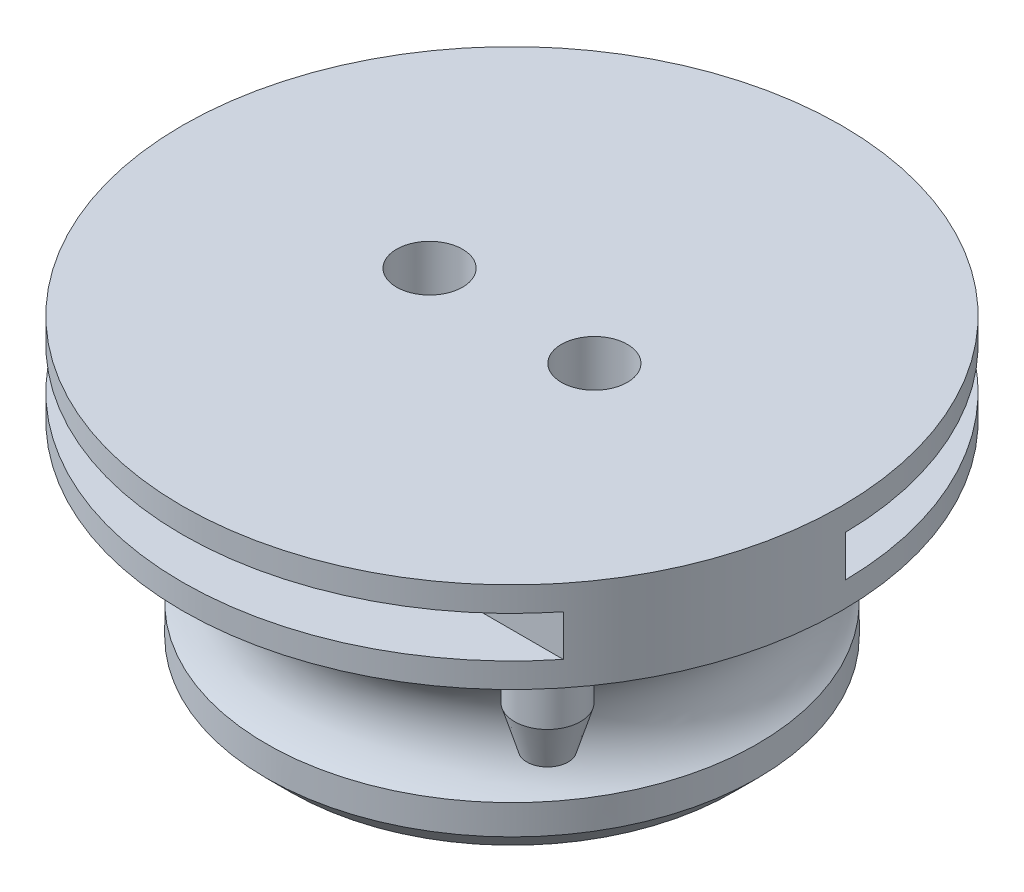
ISO-10303-21;
HEADER;
FILE_DESCRIPTION(('STEP AP214'),'2;1');
FILE_NAME('part.step','',(''),(''),'','','');
FILE_SCHEMA(('AUTOMOTIVE_DESIGN { 1 0 10303 214 1 1 1 1 }'));
ENDSEC;
DATA;
#1=APPLICATION_CONTEXT('core data for automotive mechanical design processes');
#2=APPLICATION_PROTOCOL_DEFINITION('international standard','automotive_design',2000,#1);
#3=PRODUCT_CONTEXT('',#1,'mechanical');
#4=PRODUCT('Part','Part','',(#3));
#5=PRODUCT_RELATED_PRODUCT_CATEGORY('part','',(#4));
#6=PRODUCT_DEFINITION_FORMATION('','',#4);
#7=PRODUCT_DEFINITION_CONTEXT('part definition',#1,'design');
#8=PRODUCT_DEFINITION('design','',#6,#7);
#9=PRODUCT_DEFINITION_SHAPE('','',#8);
#10=(LENGTH_UNIT() NAMED_UNIT(*) SI_UNIT(.MILLI.,.METRE.));
#11=(NAMED_UNIT(*) PLANE_ANGLE_UNIT() SI_UNIT($,.RADIAN.));
#12=(NAMED_UNIT(*) SI_UNIT($,.STERADIAN.) SOLID_ANGLE_UNIT());
#13=UNCERTAINTY_MEASURE_WITH_UNIT(LENGTH_MEASURE(1.E-05),#10,'distance_accuracy_value','');
#14=(GEOMETRIC_REPRESENTATION_CONTEXT(3) GLOBAL_UNCERTAINTY_ASSIGNED_CONTEXT((#13)) GLOBAL_UNIT_ASSIGNED_CONTEXT((#10,
#11,#12)) REPRESENTATION_CONTEXT('',''));
#15=CARTESIAN_POINT('',(0.,0.,0.));
#16=DIRECTION('',(0.,0.,1.));
#17=DIRECTION('',(1.,0.,0.));
#18=AXIS2_PLACEMENT_3D('',#15,#16,#17);
#19=CARTESIAN_POINT('',(0.,36.7,0.));
#20=DIRECTION('',(0.,-1.,0.));
#21=DIRECTION('',(0.,0.,-1.));
#22=AXIS2_PLACEMENT_3D('',#19,#20,#21);
#23=CYLINDRICAL_SURFACE('',#22,40.);
#24=CARTESIAN_POINT('',(0.,28.7,0.));
#25=DIRECTION('',(0.,1.,0.));
#26=DIRECTION('',(0.,0.,1.));
#27=AXIS2_PLACEMENT_3D('',#24,#25,#26);
#28=CIRCLE('',#27,40.);
#29=CARTESIAN_POINT('',(39.9971647780934,28.7,-0.476245434669288));
#30=VERTEX_POINT('',#29);
#31=CARTESIAN_POINT('',(-31.224989991992,28.7,-25.));
#32=VERTEX_POINT('',#31);
#33=EDGE_CURVE('E217',#30,#32,#28,.T.);
#34=ORIENTED_EDGE('',*,*,#33,.F.);
#35=DIRECTION('',(0.,1.,0.));
#36=VECTOR('',#35,1.);
#37=CARTESIAN_POINT('',(39.9971647780934,28.7,-0.476245434669288));
#38=LINE('',#37,#36);
#39=CARTESIAN_POINT('',(39.9971647780934,33.7,-0.476245434669288));
#40=VERTEX_POINT('',#39);
#41=EDGE_CURVE('E202',#30,#40,#38,.T.);
#42=ORIENTED_EDGE('',*,*,#41,.T.);
#43=CARTESIAN_POINT('',(0.,33.7,0.));
#44=DIRECTION('',(0.,1.,0.));
#45=DIRECTION('',(0.,0.,1.));
#46=AXIS2_PLACEMENT_3D('',#43,#44,#45);
#47=CIRCLE('',#46,40.);
#48=CARTESIAN_POINT('',(-31.224989991992,33.7,-25.));
#49=VERTEX_POINT('',#48);
#50=EDGE_CURVE('E234',#40,#49,#47,.T.);
#51=ORIENTED_EDGE('',*,*,#50,.T.);
#52=DIRECTION('',(0.,1.,0.));
#53=VECTOR('',#52,1.);
#54=CARTESIAN_POINT('',(-31.224989991992,28.7,-25.));
#55=LINE('',#54,#53);
#56=EDGE_CURVE('E233',#32,#49,#55,.T.);
#57=ORIENTED_EDGE('',*,*,#56,.F.);
#58=EDGE_LOOP('',(#34,#42,#51,#57));
#59=FACE_BOUND('',#58,.T.);
#60=CARTESIAN_POINT('',(0.,36.7,0.));
#61=DIRECTION('',(0.,1.,0.));
#62=DIRECTION('',(0.,0.,1.));
#63=AXIS2_PLACEMENT_3D('',#60,#61,#62);
#64=CIRCLE('',#63,40.);
#65=CARTESIAN_POINT('',(0.,36.7,40.));
#66=VERTEX_POINT('',#65);
#67=EDGE_CURVE('E411',#66,#66,#64,.T.);
#68=ORIENTED_EDGE('',*,*,#67,.F.);
#69=EDGE_LOOP('',(#68));
#70=FACE_BOUND('',#69,.T.);
#71=CARTESIAN_POINT('',(0.,25.7,0.));
#72=DIRECTION('',(0.,1.,0.));
#73=DIRECTION('',(0.,0.,1.));
#74=AXIS2_PLACEMENT_3D('',#71,#72,#73);
#75=CIRCLE('',#74,40.);
#76=CARTESIAN_POINT('',(0.,25.7,40.));
#77=VERTEX_POINT('',#76);
#78=EDGE_CURVE('E405',#77,#77,#75,.T.);
#79=ORIENTED_EDGE('',*,*,#78,.T.);
#80=EDGE_LOOP('',(#79));
#81=FACE_BOUND('',#80,.T.);
#82=CARTESIAN_POINT('',(0.,28.7,0.));
#83=DIRECTION('',(0.,1.,0.));
#84=DIRECTION('',(0.,0.,1.));
#85=AXIS2_PLACEMENT_3D('',#82,#83,#84);
#86=CIRCLE('',#85,40.);
#87=CARTESIAN_POINT('',(-39.9971647780934,28.7,0.476245434669288));
#88=VERTEX_POINT('',#87);
#89=CARTESIAN_POINT('',(31.224989991992,28.7,25.));
#90=VERTEX_POINT('',#89);
#91=EDGE_CURVE('E179',#88,#90,#86,.T.);
#92=ORIENTED_EDGE('',*,*,#91,.F.);
#93=DIRECTION('',(0.,1.,0.));
#94=VECTOR('',#93,1.);
#95=CARTESIAN_POINT('',(-39.9971647780934,28.7,0.476245434669288));
#96=LINE('',#95,#94);
#97=CARTESIAN_POINT('',(-39.9971647780934,33.7,0.476245434669288));
#98=VERTEX_POINT('',#97);
#99=EDGE_CURVE('E211',#88,#98,#96,.T.);
#100=ORIENTED_EDGE('',*,*,#99,.T.);
#101=CARTESIAN_POINT('',(0.,33.7,0.));
#102=DIRECTION('',(0.,1.,0.));
#103=DIRECTION('',(0.,0.,1.));
#104=AXIS2_PLACEMENT_3D('',#101,#102,#103);
#105=CIRCLE('',#104,40.);
#106=CARTESIAN_POINT('',(31.224989991992,33.7,25.));
#107=VERTEX_POINT('',#106);
#108=EDGE_CURVE('E185',#98,#107,#105,.T.);
#109=ORIENTED_EDGE('',*,*,#108,.T.);
#110=DIRECTION('',(0.,1.,0.));
#111=VECTOR('',#110,1.);
#112=CARTESIAN_POINT('',(31.224989991992,28.7,25.));
#113=LINE('',#112,#111);
#114=EDGE_CURVE('E207',#90,#107,#113,.T.);
#115=ORIENTED_EDGE('',*,*,#114,.F.);
#116=EDGE_LOOP('',(#92,#100,#109,#115));
#117=FACE_BOUND('',#116,.T.);
#118=ADVANCED_FACE('F89',(#59,#70,#81,#117),#23,.T.);
#119=CARTESIAN_POINT('',(0.,0.,0.));
#120=DIRECTION('',(0.,1.,0.));
#121=DIRECTION('',(0.,0.,1.));
#122=AXIS2_PLACEMENT_3D('',#119,#120,#121);
#123=PLANE('',#122);
#124=CARTESIAN_POINT('',(0.,0.,0.));
#125=DIRECTION('',(0.,1.,0.));
#126=DIRECTION('',(0.,0.,1.));
#127=AXIS2_PLACEMENT_3D('',#124,#125,#126);
#128=CIRCLE('',#127,20.2);
#129=CARTESIAN_POINT('',(0.,0.,-20.2));
#130=VERTEX_POINT('',#129);
#131=EDGE_CURVE('E426',#130,#130,#128,.T.);
#132=ORIENTED_EDGE('',*,*,#131,.T.);
#133=EDGE_LOOP('',(#132));
#134=FACE_BOUND('',#133,.T.);
#135=CARTESIAN_POINT('',(0.,0.,0.));
#136=DIRECTION('',(0.,1.,0.));
#137=DIRECTION('',(0.,0.,1.));
#138=AXIS2_PLACEMENT_3D('',#135,#136,#137);
#139=CIRCLE('',#138,26.8);
#140=CARTESIAN_POINT('',(0.,0.,26.8));
#141=VERTEX_POINT('',#140);
#142=EDGE_CURVE('E436',#141,#141,#139,.T.);
#143=ORIENTED_EDGE('',*,*,#142,.F.);
#144=EDGE_LOOP('',(#143));
#145=FACE_BOUND('',#144,.T.);
#146=ADVANCED_FACE('F459',(#134,#145),#123,.F.);
#147=CARTESIAN_POINT('',(0.,25.7,0.));
#148=DIRECTION('',(0.,-1.,0.));
#149=DIRECTION('',(0.,0.,-1.));
#150=AXIS2_PLACEMENT_3D('',#147,#148,#149);
#151=CYLINDRICAL_SURFACE('',#150,29.8);
#152=CARTESIAN_POINT('',(0.,25.7,0.));
#153=DIRECTION('',(0.,1.,0.));
#154=DIRECTION('',(0.,0.,1.));
#155=AXIS2_PLACEMENT_3D('',#152,#153,#154);
#156=CIRCLE('',#155,29.8);
#157=CARTESIAN_POINT('',(0.,25.7,-29.8));
#158=VERTEX_POINT('',#157);
#159=EDGE_CURVE('E422',#158,#158,#156,.T.);
#160=CARTESIAN_POINT('',(0.,18.7991802727908,0.));
#161=DIRECTION('',(0.,1.,0.));
#162=DIRECTION('',(0.,0.,1.));
#163=AXIS2_PLACEMENT_3D('',#160,#161,#162);
#164=CIRCLE('',#163,29.8);
#165=CARTESIAN_POINT('',(0.,18.7991802727908,-29.8));
#166=VERTEX_POINT('',#165);
#167=EDGE_CURVE('E430',#166,#166,#164,.T.);
#168=CARTESIAN_POINT('',(0.,25.7,-29.8));
#169=CARTESIAN_POINT('',(0.,25.6281164611749,-29.8));
#170=CARTESIAN_POINT('',(0.,25.5562329223498,-29.8));
#171=CARTESIAN_POINT('',(0.,25.4124658446996,-29.8));
#172=CARTESIAN_POINT('',(0.,25.3405823058745,-29.8));
#173=CARTESIAN_POINT('',(0.,25.1968152282243,-29.8));
#174=CARTESIAN_POINT('',(0.,25.1249316893992,-29.8));
#175=CARTESIAN_POINT('',(0.,24.981164611749,-29.8));
#176=CARTESIAN_POINT('',(0.,24.9092810729239,-29.8));
#177=CARTESIAN_POINT('',(0.,24.7655139952737,-29.8));
#178=CARTESIAN_POINT('',(0.,24.6936304564487,-29.8));
#179=CARTESIAN_POINT('',(0.,24.5498633787985,-29.8));
#180=CARTESIAN_POINT('',(0.,24.4779798399734,-29.8));
#181=CARTESIAN_POINT('',(0.,24.3342127623232,-29.8));
#182=CARTESIAN_POINT('',(0.,24.2623292234981,-29.8));
#183=CARTESIAN_POINT('',(0.,24.1185621458479,-29.8));
#184=CARTESIAN_POINT('',(0.,24.0466786070228,-29.8));
#185=CARTESIAN_POINT('',(0.,23.9029115293726,-29.8));
#186=CARTESIAN_POINT('',(0.,23.8310279905475,-29.8));
#187=CARTESIAN_POINT('',(0.,23.6872609128973,-29.8));
#188=CARTESIAN_POINT('',(0.,23.6153773740722,-29.8));
#189=CARTESIAN_POINT('',(0.,23.471610296422,-29.8));
#190=CARTESIAN_POINT('',(0.,23.3997267575969,-29.8));
#191=CARTESIAN_POINT('',(0.,23.2559596799467,-29.8));
#192=CARTESIAN_POINT('',(0.,23.1840761411216,-29.8));
#193=CARTESIAN_POINT('',(0.,23.0403090634714,-29.8));
#194=CARTESIAN_POINT('',(0.,22.9684255246463,-29.8));
#195=CARTESIAN_POINT('',(0.,22.8246584469961,-29.8));
#196=CARTESIAN_POINT('',(0.,22.7527749081711,-29.8));
#197=CARTESIAN_POINT('',(0.,22.6090078305209,-29.8));
#198=CARTESIAN_POINT('',(0.,22.5371242916958,-29.8));
#199=CARTESIAN_POINT('',(0.,22.3933572140456,-29.8));
#200=CARTESIAN_POINT('',(0.,22.3214736752205,-29.8));
#201=CARTESIAN_POINT('',(0.,22.1777065975703,-29.8));
#202=CARTESIAN_POINT('',(0.,22.1058230587452,-29.8));
#203=CARTESIAN_POINT('',(0.,21.962055981095,-29.8));
#204=CARTESIAN_POINT('',(0.,21.8901724422699,-29.8));
#205=CARTESIAN_POINT('',(0.,21.7464053646197,-29.8));
#206=CARTESIAN_POINT('',(0.,21.6745218257946,-29.8));
#207=CARTESIAN_POINT('',(0.,21.5307547481444,-29.8));
#208=CARTESIAN_POINT('',(0.,21.4588712093193,-29.8));
#209=CARTESIAN_POINT('',(0.,21.3151041316691,-29.8));
#210=CARTESIAN_POINT('',(0.,21.243220592844,-29.8));
#211=CARTESIAN_POINT('',(0.,21.0994535151938,-29.8));
#212=CARTESIAN_POINT('',(0.,21.0275699763687,-29.8));
#213=CARTESIAN_POINT('',(0.,20.8838028987185,-29.8));
#214=CARTESIAN_POINT('',(0.,20.8119193598935,-29.8));
#215=CARTESIAN_POINT('',(0.,20.6681522822433,-29.8));
#216=CARTESIAN_POINT('',(0.,20.5962687434182,-29.8));
#217=CARTESIAN_POINT('',(0.,20.452501665768,-29.8));
#218=CARTESIAN_POINT('',(0.,20.3806181269429,-29.8));
#219=CARTESIAN_POINT('',(0.,20.2368510492927,-29.8));
#220=CARTESIAN_POINT('',(0.,20.1649675104676,-29.8));
#221=CARTESIAN_POINT('',(0.,20.0212004328174,-29.8));
#222=CARTESIAN_POINT('',(0.,19.9493168939923,-29.8));
#223=CARTESIAN_POINT('',(0.,19.8055498163421,-29.8));
#224=CARTESIAN_POINT('',(0.,19.733666277517,-29.8));
#225=CARTESIAN_POINT('',(0.,19.5898991998668,-29.8));
#226=CARTESIAN_POINT('',(0.,19.5180156610417,-29.8));
#227=CARTESIAN_POINT('',(0.,19.3742485833915,-29.8));
#228=CARTESIAN_POINT('',(0.,19.3023650445664,-29.8));
#229=CARTESIAN_POINT('',(0.,19.1585979669162,-29.8));
#230=CARTESIAN_POINT('',(0.,19.0867144280911,-29.8));
#231=CARTESIAN_POINT('',(0.,18.9429473504409,-29.8));
#232=CARTESIAN_POINT('',(0.,18.8710638116159,-29.8));
#233=CARTESIAN_POINT('',(0.,18.7991802727908,-29.8));
#234=B_SPLINE_CURVE_WITH_KNOTS('',3,(#168,#169,#170,#171,#172,#173,#174,#175,#176,#177,#178,
#179,#180,#181,#182,#183,#184,#185,#186,#187,#188,#189,#190,#191,#192,#193,#194,#195,#196,#197,
#198,#199,#200,#201,#202,#203,#204,#205,#206,#207,#208,#209,#210,#211,#212,#213,#214,#215,#216,
#217,#218,#219,#220,#221,#222,#223,#224,#225,#226,#227,#228,#229,#230,#231,#232,#233),
.UNSPECIFIED.,.F.,.F.,(4,2,2,2,2,2,2,2,2,2,2,2,2,2,2,2,2,2,2,2,2,2,2,2,2,2,2,2,2,2,2,2,4),(0.,
0.215650616475292,0.431301232950581,0.64695184942587,0.862602465901158,1.07825308237645,
1.29390369885174,1.50955431532702,1.72520493180231,1.9408555482776,2.15650616475289,
2.37215678122818,2.58780739770347,2.80345801417876,3.01910863065405,3.23475924712933,
3.45040986360462,3.66606048007991,3.8817110965552,4.09736171303049,4.31301232950578,
4.52866294598107,4.74431356245636,4.95996417893164,5.17561479540693,5.39126541188222,
5.60691602835751,5.8225666448328,6.03821726130809,6.25386787778338,6.46951849425867,
6.68516911073395,6.90081972720924),.UNSPECIFIED.);
#235=EDGE_CURVE('BSEAM91',#158,#166,#234,.T.);
#236=ORIENTED_EDGE('',*,*,#159,.F.);
#237=ORIENTED_EDGE('',*,*,#167,.T.);
#238=ORIENTED_EDGE('',*,*,#235,.T.);
#239=ORIENTED_EDGE('',*,*,#235,.F.);
#240=EDGE_LOOP('',(#236,#238,#237,#239));
#241=FACE_BOUND('',#240,.T.);
#242=ADVANCED_FACE('F91',(#241),#151,.T.);
#243=CARTESIAN_POINT('',(0.,25.7,0.));
#244=DIRECTION('',(0.,-1.,0.));
#245=DIRECTION('',(0.,0.,-1.));
#246=AXIS2_PLACEMENT_3D('',#243,#244,#245);
#247=CYLINDRICAL_SURFACE('',#246,20.2);
#248=CARTESIAN_POINT('',(0.,25.7,0.));
#249=DIRECTION('',(0.,1.,0.));
#250=DIRECTION('',(0.,0.,1.));
#251=AXIS2_PLACEMENT_3D('',#248,#249,#250);
#252=CIRCLE('',#251,20.2);
#253=CARTESIAN_POINT('',(0.,25.7,-20.2));
#254=VERTEX_POINT('',#253);
#255=EDGE_CURVE('E431',#254,#254,#252,.T.);
#256=CARTESIAN_POINT('',(0.,25.7,-20.2));
#257=CARTESIAN_POINT('',(0.,25.4322916666667,-20.2));
#258=CARTESIAN_POINT('',(0.,25.1645833333333,-20.2));
#259=CARTESIAN_POINT('',(0.,24.6291666666667,-20.2));
#260=CARTESIAN_POINT('',(0.,24.3614583333333,-20.2));
#261=CARTESIAN_POINT('',(0.,23.8260416666667,-20.2));
#262=CARTESIAN_POINT('',(0.,23.5583333333333,-20.2));
#263=CARTESIAN_POINT('',(0.,23.0229166666667,-20.2));
#264=CARTESIAN_POINT('',(0.,22.7552083333333,-20.2));
#265=CARTESIAN_POINT('',(0.,22.2197916666667,-20.2));
#266=CARTESIAN_POINT('',(0.,21.9520833333333,-20.2));
#267=CARTESIAN_POINT('',(0.,21.4166666666667,-20.2));
#268=CARTESIAN_POINT('',(0.,21.1489583333333,-20.2));
#269=CARTESIAN_POINT('',(0.,20.6135416666667,-20.2));
#270=CARTESIAN_POINT('',(0.,20.3458333333333,-20.2));
#271=CARTESIAN_POINT('',(0.,19.8104166666667,-20.2));
#272=CARTESIAN_POINT('',(0.,19.5427083333333,-20.2));
#273=CARTESIAN_POINT('',(0.,19.0072916666667,-20.2));
#274=CARTESIAN_POINT('',(0.,18.7395833333333,-20.2));
#275=CARTESIAN_POINT('',(0.,18.2041666666667,-20.2));
#276=CARTESIAN_POINT('',(0.,17.9364583333333,-20.2));
#277=CARTESIAN_POINT('',(0.,17.4010416666667,-20.2));
#278=CARTESIAN_POINT('',(0.,17.1333333333333,-20.2));
#279=CARTESIAN_POINT('',(0.,16.5979166666667,-20.2));
#280=CARTESIAN_POINT('',(0.,16.3302083333333,-20.2));
#281=CARTESIAN_POINT('',(0.,15.7947916666667,-20.2));
#282=CARTESIAN_POINT('',(0.,15.5270833333333,-20.2));
#283=CARTESIAN_POINT('',(0.,14.9916666666667,-20.2));
#284=CARTESIAN_POINT('',(0.,14.7239583333333,-20.2));
#285=CARTESIAN_POINT('',(0.,14.1885416666667,-20.2));
#286=CARTESIAN_POINT('',(0.,13.9208333333333,-20.2));
#287=CARTESIAN_POINT('',(0.,13.3854166666667,-20.2));
#288=CARTESIAN_POINT('',(0.,13.1177083333333,-20.2));
#289=CARTESIAN_POINT('',(0.,12.5822916666667,-20.2));
#290=CARTESIAN_POINT('',(0.,12.3145833333333,-20.2));
#291=CARTESIAN_POINT('',(0.,11.7791666666667,-20.2));
#292=CARTESIAN_POINT('',(0.,11.5114583333333,-20.2));
#293=CARTESIAN_POINT('',(0.,10.9760416666667,-20.2));
#294=CARTESIAN_POINT('',(0.,10.7083333333333,-20.2));
#295=CARTESIAN_POINT('',(0.,10.1729166666667,-20.2));
#296=CARTESIAN_POINT('',(0.,9.90520833333333,-20.2));
#297=CARTESIAN_POINT('',(0.,9.36979166666666,-20.2));
#298=CARTESIAN_POINT('',(0.,9.10208333333333,-20.2));
#299=CARTESIAN_POINT('',(0.,8.56666666666666,-20.2));
#300=CARTESIAN_POINT('',(0.,8.29895833333333,-20.2));
#301=CARTESIAN_POINT('',(0.,7.76354166666666,-20.2));
#302=CARTESIAN_POINT('',(0.,7.49583333333333,-20.2));
#303=CARTESIAN_POINT('',(0.,6.96041666666666,-20.2));
#304=CARTESIAN_POINT('',(0.,6.69270833333333,-20.2));
#305=CARTESIAN_POINT('',(0.,6.15729166666666,-20.2));
#306=CARTESIAN_POINT('',(0.,5.88958333333333,-20.2));
#307=CARTESIAN_POINT('',(0.,5.35416666666666,-20.2));
#308=CARTESIAN_POINT('',(0.,5.08645833333333,-20.2));
#309=CARTESIAN_POINT('',(0.,4.55104166666666,-20.2));
#310=CARTESIAN_POINT('',(0.,4.28333333333333,-20.2));
#311=CARTESIAN_POINT('',(0.,3.74791666666666,-20.2));
#312=CARTESIAN_POINT('',(0.,3.48020833333333,-20.2));
#313=CARTESIAN_POINT('',(0.,2.94479166666666,-20.2));
#314=CARTESIAN_POINT('',(0.,2.67708333333333,-20.2));
#315=CARTESIAN_POINT('',(0.,2.14166666666666,-20.2));
#316=CARTESIAN_POINT('',(0.,1.87395833333333,-20.2));
#317=CARTESIAN_POINT('',(0.,1.33854166666666,-20.2));
#318=CARTESIAN_POINT('',(0.,1.07083333333333,-20.2));
#319=CARTESIAN_POINT('',(0.,0.535416666666664,-20.2));
#320=CARTESIAN_POINT('',(0.,0.26770833333333,-20.2));
#321=CARTESIAN_POINT('',(0.,0.,-20.2));
#322=B_SPLINE_CURVE_WITH_KNOTS('',3,(#256,#257,#258,#259,#260,#261,#262,#263,#264,#265,#266,
#267,#268,#269,#270,#271,#272,#273,#274,#275,#276,#277,#278,#279,#280,#281,#282,#283,#284,#285,
#286,#287,#288,#289,#290,#291,#292,#293,#294,#295,#296,#297,#298,#299,#300,#301,#302,#303,#304,
#305,#306,#307,#308,#309,#310,#311,#312,#313,#314,#315,#316,#317,#318,#319,#320,#321),
.UNSPECIFIED.,.F.,.F.,(4,2,2,2,2,2,2,2,2,2,2,2,2,2,2,2,2,2,2,2,2,2,2,2,2,2,2,2,2,2,2,2,4),(0.,
0.803124999999998,1.60625,2.409375,3.2125,4.015625,4.81875,5.621875,6.425,7.228125,8.03125,
8.834375,9.6375,10.440625,11.24375,12.046875,12.85,13.653125,14.45625,15.259375,16.0625,
16.865625,17.66875,18.471875,19.275,20.078125,20.88125,21.684375,22.4875,23.290625,24.09375,
24.896875,25.7),.UNSPECIFIED.);
#323=EDGE_CURVE('BSEAM730',#254,#130,#322,.T.);
#324=ORIENTED_EDGE('',*,*,#255,.T.);
#325=ORIENTED_EDGE('',*,*,#131,.F.);
#326=ORIENTED_EDGE('',*,*,#323,.T.);
#327=ORIENTED_EDGE('',*,*,#323,.F.);
#328=EDGE_LOOP('',(#324,#326,#325,#327));
#329=FACE_BOUND('',#328,.T.);
#330=ADVANCED_FACE('F730',(#329),#247,.F.);
#331=CARTESIAN_POINT('',(0.,3.00000000000001,0.));
#332=DIRECTION('',(0.,1.,0.));
#333=DIRECTION('',(0.,0.,1.));
#334=AXIS2_PLACEMENT_3D('',#331,#332,#333);
#335=CONICAL_SURFACE('',#334,29.8,0.785398163397445);
#336=ORIENTED_EDGE('',*,*,#142,.T.);
#337=EDGE_LOOP('',(#336));
#338=FACE_BOUND('',#337,.T.);
#339=CARTESIAN_POINT('',(0.,3.00000000000001,0.));
#340=DIRECTION('',(0.,1.,0.));
#341=DIRECTION('',(0.,0.,1.));
#342=AXIS2_PLACEMENT_3D('',#339,#340,#341);
#343=CIRCLE('',#342,29.8);
#344=CARTESIAN_POINT('',(0.,3.00000000000001,-29.8));
#345=VERTEX_POINT('',#344);
#346=EDGE_CURVE('E435',#345,#345,#343,.T.);
#347=ORIENTED_EDGE('',*,*,#346,.F.);
#348=EDGE_LOOP('',(#347));
#349=FACE_BOUND('',#348,.T.);
#350=ADVANCED_FACE('F720',(#338,#349),#335,.T.);
#351=CARTESIAN_POINT('',(0.,12.7,0.));
#352=DIRECTION('',(0.,1.,0.));
#353=DIRECTION('',(0.,0.,1.));
#354=AXIS2_PLACEMENT_3D('',#351,#352,#353);
#355=TOROIDAL_SURFACE('',#354,34.5,7.7);
#356=CARTESIAN_POINT('',(0.,6.60081972720924,0.));
#357=DIRECTION('',(0.,1.,0.));
#358=DIRECTION('',(0.,0.,1.));
#359=AXIS2_PLACEMENT_3D('',#356,#357,#358);
#360=CIRCLE('',#359,29.8);
#361=CARTESIAN_POINT('',(0.,6.60081972720924,-29.8));
#362=VERTEX_POINT('',#361);
#363=EDGE_CURVE('E440',#362,#362,#360,.T.);
#364=ORIENTED_EDGE('',*,*,#363,.T.);
#365=EDGE_LOOP('',(#364));
#366=FACE_BOUND('',#365,.T.);
#367=ORIENTED_EDGE('',*,*,#167,.F.);
#368=EDGE_LOOP('',(#367));
#369=FACE_BOUND('',#368,.T.);
#370=ADVANCED_FACE('F716',(#366,#369),#355,.F.);
#371=CARTESIAN_POINT('',(0.,3.00000000000001,-29.8));
#372=CARTESIAN_POINT('',(0.,3.03750853882511,-29.8));
#373=CARTESIAN_POINT('',(0.,3.07501707765021,-29.8));
#374=CARTESIAN_POINT('',(0.,3.1500341553004,-29.8));
#375=CARTESIAN_POINT('',(0.,3.18754269412549,-29.8));
#376=CARTESIAN_POINT('',(0.,3.26255977177569,-29.8));
#377=CARTESIAN_POINT('',(0.,3.30006831060078,-29.8));
#378=CARTESIAN_POINT('',(0.,3.37508538825097,-29.8));
#379=CARTESIAN_POINT('',(0.,3.41259392707607,-29.8));
#380=CARTESIAN_POINT('',(0.,3.48761100472626,-29.8));
#381=CARTESIAN_POINT('',(0.,3.52511954355136,-29.8));
#382=CARTESIAN_POINT('',(0.,3.60013662120155,-29.8));
#383=CARTESIAN_POINT('',(0.,3.63764516002665,-29.8));
#384=CARTESIAN_POINT('',(0.,3.71266223767684,-29.8));
#385=CARTESIAN_POINT('',(0.,3.75017077650193,-29.8));
#386=CARTESIAN_POINT('',(0.,3.82518785415213,-29.8));
#387=CARTESIAN_POINT('',(0.,3.86269639297722,-29.8));
#388=CARTESIAN_POINT('',(0.,3.93771347062742,-29.8));
#389=CARTESIAN_POINT('',(0.,3.97522200945251,-29.8));
#390=CARTESIAN_POINT('',(0.,4.0502390871027,-29.8));
#391=CARTESIAN_POINT('',(0.,4.0877476259278,-29.8));
#392=CARTESIAN_POINT('',(0.,4.16276470357799,-29.8));
#393=CARTESIAN_POINT('',(0.,4.20027324240309,-29.8));
#394=CARTESIAN_POINT('',(0.,4.27529032005328,-29.8));
#395=CARTESIAN_POINT('',(0.,4.31279885887838,-29.8));
#396=CARTESIAN_POINT('',(0.,4.38781593652857,-29.8));
#397=CARTESIAN_POINT('',(0.,4.42532447535367,-29.8));
#398=CARTESIAN_POINT('',(0.,4.50034155300386,-29.8));
#399=CARTESIAN_POINT('',(0.,4.53785009182895,-29.8));
#400=CARTESIAN_POINT('',(0.,4.61286716947915,-29.8));
#401=CARTESIAN_POINT('',(0.,4.65037570830424,-29.8));
#402=CARTESIAN_POINT('',(0.,4.72539278595443,-29.8));
#403=CARTESIAN_POINT('',(0.,4.76290132477953,-29.8));
#404=CARTESIAN_POINT('',(0.,4.83791840242972,-29.8));
#405=CARTESIAN_POINT('',(0.,4.87542694125482,-29.8));
#406=CARTESIAN_POINT('',(0.,4.95044401890501,-29.8));
#407=CARTESIAN_POINT('',(0.,4.98795255773011,-29.8));
#408=CARTESIAN_POINT('',(0.,5.0629696353803,-29.8));
#409=CARTESIAN_POINT('',(0.,5.1004781742054,-29.8));
#410=CARTESIAN_POINT('',(0.,5.17549525185559,-29.8));
#411=CARTESIAN_POINT('',(0.,5.21300379068068,-29.8));
#412=CARTESIAN_POINT('',(0.,5.28802086833088,-29.8));
#413=CARTESIAN_POINT('',(0.,5.32552940715597,-29.8));
#414=CARTESIAN_POINT('',(0.,5.40054648480617,-29.8));
#415=CARTESIAN_POINT('',(0.,5.43805502363126,-29.8));
#416=CARTESIAN_POINT('',(0.,5.51307210128145,-29.8));
#417=CARTESIAN_POINT('',(0.,5.55058064010655,-29.8));
#418=CARTESIAN_POINT('',(0.,5.62559771775674,-29.8));
#419=CARTESIAN_POINT('',(0.,5.66310625658184,-29.8));
#420=CARTESIAN_POINT('',(0.,5.73812333423203,-29.8));
#421=CARTESIAN_POINT('',(0.,5.77563187305713,-29.8));
#422=CARTESIAN_POINT('',(0.,5.85064895070732,-29.8));
#423=CARTESIAN_POINT('',(0.,5.88815748953242,-29.8));
#424=CARTESIAN_POINT('',(0.,5.96317456718261,-29.8));
#425=CARTESIAN_POINT('',(0.,6.0006831060077,-29.8));
#426=CARTESIAN_POINT('',(0.,6.0757001836579,-29.8));
#427=CARTESIAN_POINT('',(0.,6.11320872248299,-29.8));
#428=CARTESIAN_POINT('',(0.,6.18822580013318,-29.8));
#429=CARTESIAN_POINT('',(0.,6.22573433895828,-29.8));
#430=CARTESIAN_POINT('',(0.,6.30075141660847,-29.8));
#431=CARTESIAN_POINT('',(0.,6.33825995543357,-29.8));
#432=CARTESIAN_POINT('',(0.,6.41327703308376,-29.8));
#433=CARTESIAN_POINT('',(0.,6.45078557190886,-29.8));
#434=CARTESIAN_POINT('',(0.,6.52580264955905,-29.8));
#435=CARTESIAN_POINT('',(0.,6.56331118838414,-29.8));
#436=CARTESIAN_POINT('',(0.,6.60081972720924,-29.8));
#437=B_SPLINE_CURVE_WITH_KNOTS('',3,(#371,#372,#373,#374,#375,#376,#377,#378,#379,#380,#381,
#382,#383,#384,#385,#386,#387,#388,#389,#390,#391,#392,#393,#394,#395,#396,#397,#398,#399,#400,
#401,#402,#403,#404,#405,#406,#407,#408,#409,#410,#411,#412,#413,#414,#415,#416,#417,#418,#419,
#420,#421,#422,#423,#424,#425,#426,#427,#428,#429,#430,#431,#432,#433,#434,#435,#436),
.UNSPECIFIED.,.F.,.F.,(4,2,2,2,2,2,2,2,2,2,2,2,2,2,2,2,2,2,2,2,2,2,2,2,2,2,2,2,2,2,2,2,4),(0.,
0.11252561647529,0.225051232950576,0.337576849425866,0.450102465901152,0.562628082376442,
0.675153698851731,0.787679315327017,0.900204931802307,1.0127305482776,1.12525616475288,
1.23778178122817,1.35030739770346,1.46283301417875,1.57535863065404,1.68788424712932,
1.80040986360461,1.9129354800799,2.02546109655519,2.13798671303048,2.25051232950577,
2.36303794598106,2.47556356245635,2.58808917893163,2.70061479540692,2.81314041188221,
2.9256660283575,3.03819164483279,3.15071726130808,3.26324287778336,3.37576849425865,
3.48829411073394,3.60081972720923),.UNSPECIFIED.);
#438=EDGE_CURVE('BSEAM561',#345,#362,#437,.T.);
#439=ORIENTED_EDGE('',*,*,#346,.T.);
#440=ORIENTED_EDGE('',*,*,#363,.F.);
#441=ORIENTED_EDGE('',*,*,#438,.T.);
#442=ORIENTED_EDGE('',*,*,#438,.F.);
#443=EDGE_LOOP('',(#439,#441,#440,#442));
#444=FACE_BOUND('',#443,.T.);
#445=ADVANCED_FACE('F561',(#444),#151,.T.);
#446=CARTESIAN_POINT('',(0.,25.7,0.));
#447=DIRECTION('',(0.,1.,0.));
#448=DIRECTION('',(0.,0.,1.));
#449=AXIS2_PLACEMENT_3D('',#446,#447,#448);
#450=PLANE('',#449);
#451=CARTESIAN_POINT('',(10.,25.7,0.));
#452=DIRECTION('',(0.,-1.,0.));
#453=DIRECTION('',(0.,0.,-1.));
#454=AXIS2_PLACEMENT_3D('',#451,#452,#453);
#455=CIRCLE('',#454,4.);
#456=CARTESIAN_POINT('',(10.,25.7,-4.));
#457=VERTEX_POINT('',#456);
#458=EDGE_CURVE('E238',#457,#457,#455,.T.);
#459=ORIENTED_EDGE('',*,*,#458,.F.);
#460=EDGE_LOOP('',(#459));
#461=FACE_BOUND('',#460,.T.);
#462=CARTESIAN_POINT('',(-10.,25.7,0.));
#463=DIRECTION('',(0.,-1.,0.));
#464=DIRECTION('',(0.,0.,-1.));
#465=AXIS2_PLACEMENT_3D('',#462,#463,#464);
#466=CIRCLE('',#465,4.);
#467=CARTESIAN_POINT('',(-10.,25.7,-4.));
#468=VERTEX_POINT('',#467);
#469=EDGE_CURVE('E192',#468,#468,#466,.T.);
#470=ORIENTED_EDGE('',*,*,#469,.F.);
#471=EDGE_LOOP('',(#470));
#472=FACE_BOUND('',#471,.T.);
#473=ORIENTED_EDGE('',*,*,#255,.F.);
#474=EDGE_LOOP('',(#473));
#475=FACE_BOUND('',#474,.T.);
#476=ADVANCED_FACE('F556',(#461,#472,#475),#450,.F.);
#477=CARTESIAN_POINT('',(0.,36.7,0.));
#478=DIRECTION('',(0.,1.,0.));
#479=DIRECTION('',(0.,0.,1.));
#480=AXIS2_PLACEMENT_3D('',#477,#478,#479);
#481=PLANE('',#480);
#482=CARTESIAN_POINT('',(10.,36.7,0.));
#483=DIRECTION('',(0.,1.,0.));
#484=DIRECTION('',(0.,0.,1.));
#485=AXIS2_PLACEMENT_3D('',#482,#483,#484);
#486=CIRCLE('',#485,4.);
#487=CARTESIAN_POINT('',(10.,36.7,4.));
#488=VERTEX_POINT('',#487);
#489=EDGE_CURVE('E844',#488,#488,#486,.F.);
#490=ORIENTED_EDGE('',*,*,#489,.T.);
#491=EDGE_LOOP('',(#490));
#492=FACE_BOUND('',#491,.T.);
#493=CARTESIAN_POINT('',(-10.,36.7,0.));
#494=DIRECTION('',(0.,1.,0.));
#495=DIRECTION('',(0.,0.,1.));
#496=AXIS2_PLACEMENT_3D('',#493,#494,#495);
#497=CIRCLE('',#496,4.);
#498=CARTESIAN_POINT('',(-10.,36.7,4.));
#499=VERTEX_POINT('',#498);
#500=EDGE_CURVE('E850',#499,#499,#497,.F.);
#501=ORIENTED_EDGE('',*,*,#500,.T.);
#502=EDGE_LOOP('',(#501));
#503=FACE_BOUND('',#502,.T.);
#504=ORIENTED_EDGE('',*,*,#67,.T.);
#505=EDGE_LOOP('',(#504));
#506=FACE_BOUND('',#505,.T.);
#507=ADVANCED_FACE('F455',(#492,#503,#506),#481,.T.);
#508=CARTESIAN_POINT('',(6.07768621834294,25.7,-34.4682713554272));
#509=DIRECTION('',(0.,1.,0.));
#510=DIRECTION('',(0.,0.,1.));
#511=AXIS2_PLACEMENT_3D('',#508,#509,#510);
#512=CIRCLE('',#511,3.99999999999999);
#513=CARTESIAN_POINT('',(6.07768621834294,25.7,-30.4682713554272));
#514=VERTEX_POINT('',#513);
#515=EDGE_CURVE('E12',#514,#514,#512,.F.);
#516=ORIENTED_EDGE('',*,*,#515,.F.);
#517=EDGE_LOOP('',(#516));
#518=FACE_BOUND('',#517,.T.);
#519=CARTESIAN_POINT('',(26.811555509164,25.7,22.4975663390291));
#520=DIRECTION('',(0.,1.,0.));
#521=DIRECTION('',(0.,0.,1.));
#522=AXIS2_PLACEMENT_3D('',#519,#520,#521);
#523=CIRCLE('',#522,3.99999999999999);
#524=CARTESIAN_POINT('',(26.811555509164,25.7,26.4975663390291));
#525=VERTEX_POINT('',#524);
#526=EDGE_CURVE('E101',#525,#525,#523,.F.);
#527=ORIENTED_EDGE('',*,*,#526,.F.);
#528=EDGE_LOOP('',(#527));
#529=FACE_BOUND('',#528,.T.);
#530=CARTESIAN_POINT('',(-32.8892417275069,25.7,11.9707050163982));
#531=DIRECTION('',(0.,1.,0.));
#532=DIRECTION('',(0.,0.,1.));
#533=AXIS2_PLACEMENT_3D('',#530,#531,#532);
#534=CIRCLE('',#533,4.);
#535=CARTESIAN_POINT('',(-32.8892417275069,25.7,15.9707050163982));
#536=VERTEX_POINT('',#535);
#537=EDGE_CURVE('E418',#536,#536,#534,.F.);
#538=ORIENTED_EDGE('',*,*,#537,.F.);
#539=EDGE_LOOP('',(#538));
#540=FACE_BOUND('',#539,.T.);
#541=ORIENTED_EDGE('',*,*,#159,.T.);
#542=EDGE_LOOP('',(#541));
#543=FACE_BOUND('',#542,.T.);
#544=ORIENTED_EDGE('',*,*,#78,.F.);
#545=EDGE_LOOP('',(#544));
#546=FACE_BOUND('',#545,.T.);
#547=ADVANCED_FACE('F564',(#518,#529,#540,#543,#546),#450,.F.);
#548=CARTESIAN_POINT('',(-32.8892417275069,20.7,11.9707050163982));
#549=DIRECTION('',(0.,1.,0.));
#550=DIRECTION('',(0.,0.,1.));
#551=AXIS2_PLACEMENT_3D('',#548,#549,#550);
#552=CYLINDRICAL_SURFACE('',#551,4.);
#553=CARTESIAN_POINT('',(-32.8892417275069,20.7,11.9707050163982));
#554=DIRECTION('',(0.,1.,0.));
#555=DIRECTION('',(0.,0.,1.));
#556=AXIS2_PLACEMENT_3D('',#553,#554,#555);
#557=CIRCLE('',#556,4.);
#558=CARTESIAN_POINT('',(-32.8892417275069,20.7,15.9707050163982));
#559=VERTEX_POINT('',#558);
#560=EDGE_CURVE('E402',#559,#559,#557,.F.);
#561=ORIENTED_EDGE('',*,*,#560,.F.);
#562=EDGE_LOOP('',(#561));
#563=FACE_BOUND('',#562,.T.);
#564=ORIENTED_EDGE('',*,*,#537,.T.);
#565=EDGE_LOOP('',(#564));
#566=FACE_BOUND('',#565,.T.);
#567=ADVANCED_FACE('F385',(#563,#566),#552,.T.);
#568=CARTESIAN_POINT('',(26.811555509164,20.7,22.4975663390291));
#569=DIRECTION('',(0.,1.,0.));
#570=DIRECTION('',(0.,0.,1.));
#571=AXIS2_PLACEMENT_3D('',#568,#569,#570);
#572=CYLINDRICAL_SURFACE('',#571,3.99999999999999);
#573=CARTESIAN_POINT('',(26.811555509164,20.7,22.4975663390291));
#574=DIRECTION('',(0.,-1.,0.));
#575=DIRECTION('',(0.444872770790535,0.,0.895593779460952));
#576=AXIS2_PLACEMENT_3D('',#573,#574,#575);
#577=CIRCLE('',#576,3.99999999999999);
#578=CARTESIAN_POINT('',(28.5910465923262,20.7,26.0799414568729));
#579=VERTEX_POINT('',#578);
#580=EDGE_CURVE('E313',#579,#579,#577,.T.);
#581=ORIENTED_EDGE('',*,*,#580,.F.);
#582=EDGE_LOOP('',(#581));
#583=FACE_BOUND('',#582,.T.);
#584=ORIENTED_EDGE('',*,*,#526,.T.);
#585=EDGE_LOOP('',(#584));
#586=FACE_BOUND('',#585,.T.);
#587=ADVANCED_FACE('F380',(#583,#586),#572,.T.);
#588=CARTESIAN_POINT('',(6.07768621834294,20.7,-34.4682713554272));
#589=DIRECTION('',(0.,1.,0.));
#590=DIRECTION('',(0.,0.,1.));
#591=AXIS2_PLACEMENT_3D('',#588,#589,#590);
#592=CYLINDRICAL_SURFACE('',#591,3.99999999999999);
#593=CARTESIAN_POINT('',(9.92274277805961,20.7,-33.3657560255656));
#594=CARTESIAN_POINT('',(9.77842385886114,20.7,-32.8624392988722));
#595=CARTESIAN_POINT('',(9.28977565144664,20.7,-31.9131559766337));
#596=CARTESIAN_POINT('',(8.06747882510487,20.7,-30.8786077206912));
#597=CARTESIAN_POINT('',(6.54237405059633,20.6999999999999,-30.3903848743829));
#598=CARTESIAN_POINT('',(4.94641337355436,20.7,-30.5229748243665));
#599=CARTESIAN_POINT('',(3.52274631687992,20.7,-31.2562126757547));
#600=CARTESIAN_POINT('',(2.48800272529876,20.7,-32.4784609405589));
#601=CARTESIAN_POINT('',(1.9998203520143,20.6999999999999,-34.0036035943985));
#602=CARTESIAN_POINT('',(2.13238257146794,20.7000000000001,-35.5995311130102));
#603=CARTESIAN_POINT('',(2.86565092307496,20.6999999999999,-37.0232146843214));
#604=CARTESIAN_POINT('',(4.08783717913791,20.7000000000001,-38.0579334382041));
#605=CARTESIAN_POINT('',(5.61303375546752,20.6999999999999,-38.5461552368652));
#606=CARTESIAN_POINT('',(7.2089311065233,20.7000000000001,-38.413575902648));
#607=CARTESIAN_POINT('',(8.63265749261439,20.7,-37.6803134973326));
#608=CARTESIAN_POINT('',(9.66732267582051,20.7,-36.458112990236));
#609=CARTESIAN_POINT('',(10.1556891666374,20.7,-34.9330563367945));
#610=CARTESIAN_POINT('',(10.0670616972581,20.7,-33.8690727522591));
#611=CARTESIAN_POINT('',(9.92274277805961,20.7,-33.3657560255656));
#612=B_SPLINE_CURVE_WITH_KNOTS('',3,(#593,#594,#595,#596,#597,#598,#599,#600,#601,#602,#603,
#604,#605,#606,#607,#608,#609,#610,#611),.UNSPECIFIED.,.T.,.F.,(4,1,1,1,1,1,1,1,1,1,1,1,1,1,1,1,
4),(0.,0.0625,0.125,0.1875,0.25,0.3125,0.375,0.4375,0.5,0.5625,0.625,0.6875,0.75,0.8125,0.875,
0.9375,1.),.UNSPECIFIED.);
#613=CARTESIAN_POINT('',(9.92274277805961,20.7,-33.3657560255656));
#614=VERTEX_POINT('',#613);
#615=EDGE_CURVE('E262',#614,#614,#612,.T.);
#616=ORIENTED_EDGE('',*,*,#615,.F.);
#617=EDGE_LOOP('',(#616));
#618=FACE_BOUND('',#617,.T.);
#619=ORIENTED_EDGE('',*,*,#515,.T.);
#620=EDGE_LOOP('',(#619));
#621=FACE_BOUND('',#620,.T.);
#622=ADVANCED_FACE('F376',(#618,#621),#592,.T.);
#623=CARTESIAN_POINT('',(-32.8892417275069,15.7,11.9707050163982));
#624=DIRECTION('',(0.,-1.,0.));
#625=DIRECTION('',(0.,0.,-1.));
#626=AXIS2_PLACEMENT_3D('',#623,#624,#625);
#627=PLANE('',#626);
#628=CARTESIAN_POINT('',(-32.8892417275069,15.7,11.9707050163982));
#629=DIRECTION('',(0.,-1.,0.));
#630=DIRECTION('',(0.,0.,-1.));
#631=AXIS2_PLACEMENT_3D('',#628,#629,#630);
#632=CIRCLE('',#631,2.5);
#633=CARTESIAN_POINT('',(-32.8892417275069,15.7,9.4707050163982));
#634=VERTEX_POINT('',#633);
#635=EDGE_CURVE('E347',#634,#634,#632,.T.);
#636=ORIENTED_EDGE('',*,*,#635,.T.);
#637=EDGE_LOOP('',(#636));
#638=FACE_BOUND('',#637,.T.);
#639=ADVANCED_FACE('F368',(#638),#627,.T.);
#640=CARTESIAN_POINT('',(-32.8892417275069,15.7,11.9707050163982));
#641=DIRECTION('',(0.,1.,0.));
#642=DIRECTION('',(0.,0.,1.));
#643=AXIS2_PLACEMENT_3D('',#640,#641,#642);
#644=CONICAL_SURFACE('',#643,2.5,0.291456794477866);
#645=ORIENTED_EDGE('',*,*,#560,.T.);
#646=EDGE_LOOP('',(#645));
#647=FACE_BOUND('',#646,.T.);
#648=ORIENTED_EDGE('',*,*,#635,.F.);
#649=EDGE_LOOP('',(#648));
#650=FACE_BOUND('',#649,.T.);
#651=ADVANCED_FACE('F329',(#647,#650),#644,.T.);
#652=CARTESIAN_POINT('',(26.811555509164,15.7,22.4975663390291));
#653=DIRECTION('',(0.,1.,0.));
#654=DIRECTION('',(0.,0.,1.));
#655=AXIS2_PLACEMENT_3D('',#652,#653,#654);
#656=CONICAL_SURFACE('',#655,2.5,0.291456794477866);
#657=ORIENTED_EDGE('',*,*,#580,.T.);
#658=EDGE_LOOP('',(#657));
#659=FACE_BOUND('',#658,.T.);
#660=CARTESIAN_POINT('',(26.811555509164,15.7,22.4975663390291));
#661=DIRECTION('',(0.,-1.,0.));
#662=DIRECTION('',(0.,0.,-1.));
#663=AXIS2_PLACEMENT_3D('',#660,#661,#662);
#664=CIRCLE('',#663,2.5);
#665=CARTESIAN_POINT('',(26.811555509164,15.7,19.9975663390291));
#666=VERTEX_POINT('',#665);
#667=EDGE_CURVE('E306',#666,#666,#664,.T.);
#668=ORIENTED_EDGE('',*,*,#667,.F.);
#669=EDGE_LOOP('',(#668));
#670=FACE_BOUND('',#669,.T.);
#671=ADVANCED_FACE('F320',(#659,#670),#656,.T.);
#672=CARTESIAN_POINT('',(26.811555509164,15.7,22.4975663390291));
#673=DIRECTION('',(0.,-1.,0.));
#674=DIRECTION('',(0.,0.,-1.));
#675=AXIS2_PLACEMENT_3D('',#672,#673,#674);
#676=PLANE('',#675);
#677=ORIENTED_EDGE('',*,*,#667,.T.);
#678=EDGE_LOOP('',(#677));
#679=FACE_BOUND('',#678,.T.);
#680=ADVANCED_FACE('F282',(#679),#676,.T.);
#681=CARTESIAN_POINT('',(9.92274277805961,20.7,-33.3657560255656));
#682=CARTESIAN_POINT('',(8.3134388370188,15.7,-33.3496068712837));
#683=CARTESIAN_POINT('',(9.77842385886114,20.7,-32.8624392988722));
#684=CARTESIAN_POINT('',(8.1670059984681,15.7,-33.0569475378639));
#685=CARTESIAN_POINT('',(9.28977565144664,20.7,-31.9131559766337));
#686=CARTESIAN_POINT('',(7.75786880844799,15.7,-32.5298056169366));
#687=CARTESIAN_POINT('',(8.06747882510487,20.7,-30.8786077206912));
#688=CARTESIAN_POINT('',(6.88811309006884,15.7,-32.0345065129057));
#689=CARTESIAN_POINT('',(6.54237405059633,20.6999999999999,-30.3903848743829));
#690=CARTESIAN_POINT('',(5.89513790244253,15.7,-31.9096028192392));
#691=CARTESIAN_POINT('',(4.94641337355436,20.7,-30.5229748243665));
#692=CARTESIAN_POINT('',(4.92984946776882,15.7,-32.1742340814621));
#693=CARTESIAN_POINT('',(3.52274631687992,20.7,-31.2562126757547));
#694=CARTESIAN_POINT('',(4.13934895097468,15.7,-32.7881122925071));
#695=CARTESIAN_POINT('',(2.48800272529876,20.7,-32.4784609405589));
#696=CARTESIAN_POINT('',(3.64393579852019,15.7,-33.6577485262203));
#697=CARTESIAN_POINT('',(1.9998203520143,20.6999999999999,-34.0036035943985));
#698=CARTESIAN_POINT('',(3.51900528718902,15.7,-34.6508287679121));
#699=CARTESIAN_POINT('',(2.13238257146794,20.7000000000001,-35.5995311130102));
#700=CARTESIAN_POINT('',(3.78365855238356,15.7,-35.6160939070435));
#701=CARTESIAN_POINT('',(2.86565092307496,20.6999999999999,-37.0232146843214));
#702=CARTESIAN_POINT('',(4.39752464211803,15.7,-36.4066295251371));
#703=CARTESIAN_POINT('',(4.08783717913791,20.7000000000001,-38.0579334382041));
#704=CARTESIAN_POINT('',(5.26722667980561,15.7,-36.9020428523116));
#705=CARTESIAN_POINT('',(5.61303375546752,20.6999999999999,-38.5461552368652));
#706=CARTESIAN_POINT('',(6.26025415130623,15.7,-37.0269340507888));
#707=CARTESIAN_POINT('',(7.2089311065233,20.7000000000001,-38.413575902648));
#708=CARTESIAN_POINT('',(7.22550794664661,15.7,-36.7623161458233));
#709=CARTESIAN_POINT('',(8.63265749261439,20.7,-37.6803134973326));
#710=CARTESIAN_POINT('',(8.01603992173317,15.7,-36.1484182199216));
#711=CARTESIAN_POINT('',(9.66732267582051,20.7,-36.458112990236));
#712=CARTESIAN_POINT('',(8.51141172707929,15.7,-35.2788163395182));
#713=CARTESIAN_POINT('',(10.1556891666374,20.7,-34.9330563367945));
#714=CARTESIAN_POINT('',(8.63646583975224,15.7,-34.2857616174557));
#715=CARTESIAN_POINT('',(10.0670616972581,20.7,-33.8690727522591));
#716=CARTESIAN_POINT('',(8.45987167556951,15.7,-33.6422662047036));
#717=CARTESIAN_POINT('',(9.92274277805961,20.7,-33.3657560255656));
#718=CARTESIAN_POINT('',(8.3134388370188,15.7,-33.3496068712837));
#719=B_SPLINE_SURFACE_WITH_KNOTS('',3,1,((#681,#682),(#683,#684),(#685,#686),(#687,#688),(#689,
#690),(#691,#692),(#693,#694),(#695,#696),(#697,#698),(#699,#700),(#701,#702),(#703,#704),(#705,
#706),(#707,#708),(#709,#710),(#711,#712),(#713,#714),(#715,#716),(#717,#718)),.UNSPECIFIED.,
.T.,.F.,.F.,(4,1,1,1,1,1,1,1,1,1,1,1,1,1,1,1,4),(2,2),(0.,0.0625,0.125,0.1875,0.25,0.3125,0.375,
0.4375,0.5,0.5625,0.625,0.6875,0.75,0.8125,0.875,0.9375,1.),(0.,1.),.UNSPECIFIED.);
#720=CARTESIAN_POINT('',(6.07768621834294,15.7,-34.4682713554272));
#721=DIRECTION('',(0.,-1.,0.));
#722=DIRECTION('',(0.,0.,-1.));
#723=AXIS2_PLACEMENT_3D('',#720,#721,#722);
#724=CIRCLE('',#723,2.5);
#725=CARTESIAN_POINT('',(6.07768621834294,15.7,-36.9682713554272));
#726=VERTEX_POINT('',#725);
#727=EDGE_CURVE('E210',#726,#726,#724,.T.);
#728=ORIENTED_EDGE('',*,*,#615,.T.);
#729=EDGE_LOOP('',(#728));
#730=FACE_BOUND('',#729,.T.);
#731=ORIENTED_EDGE('',*,*,#727,.F.);
#732=EDGE_LOOP('',(#731));
#733=FACE_BOUND('',#732,.T.);
#734=ADVANCED_FACE('F269',(#730,#733),#719,.T.);
#735=CARTESIAN_POINT('',(6.07768621834294,15.7,-34.4682713554272));
#736=DIRECTION('',(0.,-1.,0.));
#737=DIRECTION('',(0.,0.,-1.));
#738=AXIS2_PLACEMENT_3D('',#735,#736,#737);
#739=PLANE('',#738);
#740=ORIENTED_EDGE('',*,*,#727,.T.);
#741=EDGE_LOOP('',(#740));
#742=FACE_BOUND('',#741,.T.);
#743=ADVANCED_FACE('F281',(#742),#739,.T.);
#744=CARTESIAN_POINT('',(0.,28.7,0.));
#745=DIRECTION('',(0.0119061358667322,0.,0.999929119452335));
#746=DIRECTION('',(0.999929119452335,0.,-0.0119061358667322));
#747=AXIS2_PLACEMENT_3D('',#744,#745,#746);
#748=PLANE('',#747);
#749=DIRECTION('',(0.999929119452336,0.,-0.0119061358667322));
#750=VECTOR('',#749,1.);
#751=CARTESIAN_POINT('',(0.,33.7,0.));
#752=LINE('',#751,#750);
#753=CARTESIAN_POINT('',(24.9982279863084,33.7,-0.297653396668305));
#754=VERTEX_POINT('',#753);
#755=EDGE_CURVE('E222',#754,#40,#752,.T.);
#756=ORIENTED_EDGE('',*,*,#755,.T.);
#757=ORIENTED_EDGE('',*,*,#41,.F.);
#758=DIRECTION('',(0.999929119452336,0.,-0.0119061358667322));
#759=VECTOR('',#758,1.);
#760=CARTESIAN_POINT('',(0.,28.7,0.));
#761=LINE('',#760,#759);
#762=CARTESIAN_POINT('',(24.9982279863084,28.7,-0.297653396668305));
#763=VERTEX_POINT('',#762);
#764=EDGE_CURVE('E229',#763,#30,#761,.T.);
#765=ORIENTED_EDGE('',*,*,#764,.F.);
#766=DIRECTION('',(0.,1.,0.));
#767=VECTOR('',#766,1.);
#768=CARTESIAN_POINT('',(24.9982279863084,28.7,-0.297653396668305));
#769=LINE('',#768,#767);
#770=EDGE_CURVE('E250',#763,#754,#769,.T.);
#771=ORIENTED_EDGE('',*,*,#770,.T.);
#772=EDGE_LOOP('',(#756,#757,#765,#771));
#773=FACE_BOUND('',#772,.T.);
#774=ADVANCED_FACE('F486',(#773),#748,.F.);
#775=CARTESIAN_POINT('',(0.,28.7,0.));
#776=DIRECTION('',(0.,1.,0.));
#777=DIRECTION('',(0.,0.,1.));
#778=AXIS2_PLACEMENT_3D('',#775,#776,#777);
#779=CYLINDRICAL_SURFACE('',#778,25.);
#780=CARTESIAN_POINT('',(0.,33.7,0.));
#781=DIRECTION('',(0.,1.,0.));
#782=DIRECTION('',(0.,0.,1.));
#783=AXIS2_PLACEMENT_3D('',#780,#781,#782);
#784=CIRCLE('',#783,25.);
#785=CARTESIAN_POINT('',(0.,33.7,-25.));
#786=VERTEX_POINT('',#785);
#787=EDGE_CURVE('E241',#754,#786,#784,.T.);
#788=ORIENTED_EDGE('',*,*,#787,.F.);
#789=ORIENTED_EDGE('',*,*,#770,.F.);
#790=CARTESIAN_POINT('',(0.,28.7,0.));
#791=DIRECTION('',(0.,1.,0.));
#792=DIRECTION('',(0.,0.,1.));
#793=AXIS2_PLACEMENT_3D('',#790,#791,#792);
#794=CIRCLE('',#793,25.);
#795=CARTESIAN_POINT('',(0.,28.7,-25.));
#796=VERTEX_POINT('',#795);
#797=EDGE_CURVE('E226',#763,#796,#794,.T.);
#798=ORIENTED_EDGE('',*,*,#797,.T.);
#799=DIRECTION('',(0.,1.,0.));
#800=VECTOR('',#799,1.);
#801=CARTESIAN_POINT('',(0.,28.7,-25.));
#802=LINE('',#801,#800);
#803=EDGE_CURVE('E253',#796,#786,#802,.T.);
#804=ORIENTED_EDGE('',*,*,#803,.T.);
#805=EDGE_LOOP('',(#788,#789,#798,#804));
#806=FACE_BOUND('',#805,.T.);
#807=ADVANCED_FACE('F488',(#806),#779,.T.);
#808=CARTESIAN_POINT('',(0.,28.7,-25.));
#809=DIRECTION('',(0.,0.,1.));
#810=DIRECTION('',(1.,0.,0.));
#811=AXIS2_PLACEMENT_3D('',#808,#809,#810);
#812=PLANE('',#811);
#813=DIRECTION('',(1.,0.,0.));
#814=VECTOR('',#813,1.);
#815=CARTESIAN_POINT('',(0.,33.7,-25.));
#816=LINE('',#815,#814);
#817=EDGE_CURVE('E117',#49,#786,#816,.T.);
#818=ORIENTED_EDGE('',*,*,#817,.T.);
#819=ORIENTED_EDGE('',*,*,#803,.F.);
#820=DIRECTION('',(1.,0.,0.));
#821=VECTOR('',#820,1.);
#822=CARTESIAN_POINT('',(0.,28.7,-25.));
#823=LINE('',#822,#821);
#824=EDGE_CURVE('E221',#32,#796,#823,.T.);
#825=ORIENTED_EDGE('',*,*,#824,.F.);
#826=ORIENTED_EDGE('',*,*,#56,.T.);
#827=EDGE_LOOP('',(#818,#819,#825,#826));
#828=FACE_BOUND('',#827,.T.);
#829=ADVANCED_FACE('F283',(#828),#812,.F.);
#830=CARTESIAN_POINT('',(0.,28.7,0.));
#831=DIRECTION('',(0.,1.,0.));
#832=DIRECTION('',(0.,0.,1.));
#833=AXIS2_PLACEMENT_3D('',#830,#831,#832);
#834=PLANE('',#833);
#835=ORIENTED_EDGE('',*,*,#33,.T.);
#836=ORIENTED_EDGE('',*,*,#824,.T.);
#837=ORIENTED_EDGE('',*,*,#797,.F.);
#838=ORIENTED_EDGE('',*,*,#764,.T.);
#839=EDGE_LOOP('',(#835,#836,#837,#838));
#840=FACE_BOUND('',#839,.T.);
#841=ADVANCED_FACE('F480',(#840),#834,.T.);
#842=CARTESIAN_POINT('',(0.,33.7,0.));
#843=DIRECTION('',(0.,1.,0.));
#844=DIRECTION('',(0.,0.,1.));
#845=AXIS2_PLACEMENT_3D('',#842,#843,#844);
#846=PLANE('',#845);
#847=ORIENTED_EDGE('',*,*,#50,.F.);
#848=ORIENTED_EDGE('',*,*,#755,.F.);
#849=ORIENTED_EDGE('',*,*,#787,.T.);
#850=ORIENTED_EDGE('',*,*,#817,.F.);
#851=EDGE_LOOP('',(#847,#848,#849,#850));
#852=FACE_BOUND('',#851,.T.);
#853=ADVANCED_FACE('F475',(#852),#846,.F.);
#854=CARTESIAN_POINT('',(0.,28.7,25.));
#855=DIRECTION('',(0.,0.,1.));
#856=DIRECTION('',(1.,0.,0.));
#857=AXIS2_PLACEMENT_3D('',#854,#855,#856);
#858=PLANE('',#857);
#859=DIRECTION('',(1.,0.,0.));
#860=VECTOR('',#859,1.);
#861=CARTESIAN_POINT('',(0.,33.7,25.));
#862=LINE('',#861,#860);
#863=CARTESIAN_POINT('',(0.,33.7,25.));
#864=VERTEX_POINT('',#863);
#865=EDGE_CURVE('E109',#864,#107,#862,.T.);
#866=ORIENTED_EDGE('',*,*,#865,.F.);
#867=DIRECTION('',(0.,1.,0.));
#868=VECTOR('',#867,1.);
#869=CARTESIAN_POINT('',(0.,28.7,25.));
#870=LINE('',#869,#868);
#871=CARTESIAN_POINT('',(0.,28.7,25.));
#872=VERTEX_POINT('',#871);
#873=EDGE_CURVE('E165',#872,#864,#870,.T.);
#874=ORIENTED_EDGE('',*,*,#873,.F.);
#875=DIRECTION('',(1.,0.,0.));
#876=VECTOR('',#875,1.);
#877=CARTESIAN_POINT('',(0.,28.7,25.));
#878=LINE('',#877,#876);
#879=EDGE_CURVE('E173',#872,#90,#878,.T.);
#880=ORIENTED_EDGE('',*,*,#879,.T.);
#881=ORIENTED_EDGE('',*,*,#114,.T.);
#882=EDGE_LOOP('',(#866,#874,#880,#881));
#883=FACE_BOUND('',#882,.T.);
#884=ADVANCED_FACE('F176',(#883),#858,.T.);
#885=CARTESIAN_POINT('',(0.,28.7,0.));
#886=DIRECTION('',(-0.0119061358667322,0.,-0.999929119452335));
#887=DIRECTION('',(-0.999929119452335,0.,0.0119061358667322));
#888=AXIS2_PLACEMENT_3D('',#885,#886,#887);
#889=PLANE('',#888);
#890=DIRECTION('',(-0.999929119452336,0.,0.0119061358667322));
#891=VECTOR('',#890,1.);
#892=CARTESIAN_POINT('',(0.,33.7,0.));
#893=LINE('',#892,#891);
#894=CARTESIAN_POINT('',(-24.9982279863084,33.7,0.297653396668305));
#895=VERTEX_POINT('',#894);
#896=EDGE_CURVE('E189',#895,#98,#893,.T.);
#897=ORIENTED_EDGE('',*,*,#896,.T.);
#898=ORIENTED_EDGE('',*,*,#99,.F.);
#899=DIRECTION('',(-0.999929119452336,0.,0.0119061358667322));
#900=VECTOR('',#899,1.);
#901=CARTESIAN_POINT('',(0.,28.7,0.));
#902=LINE('',#901,#900);
#903=CARTESIAN_POINT('',(-24.9982279863084,28.7,0.297653396668305));
#904=VERTEX_POINT('',#903);
#905=EDGE_CURVE('E172',#904,#88,#902,.T.);
#906=ORIENTED_EDGE('',*,*,#905,.F.);
#907=DIRECTION('',(0.,1.,0.));
#908=VECTOR('',#907,1.);
#909=CARTESIAN_POINT('',(-24.9982279863084,28.7,0.297653396668305));
#910=LINE('',#909,#908);
#911=EDGE_CURVE('E166',#904,#895,#910,.T.);
#912=ORIENTED_EDGE('',*,*,#911,.T.);
#913=EDGE_LOOP('',(#897,#898,#906,#912));
#914=FACE_BOUND('',#913,.T.);
#915=ADVANCED_FACE('F467',(#914),#889,.F.);
#916=CARTESIAN_POINT('',(0.,28.7,0.));
#917=DIRECTION('',(0.,1.,0.));
#918=DIRECTION('',(0.,0.,1.));
#919=AXIS2_PLACEMENT_3D('',#916,#917,#918);
#920=CYLINDRICAL_SURFACE('',#919,25.);
#921=CARTESIAN_POINT('',(0.,33.7,0.));
#922=DIRECTION('',(0.,1.,0.));
#923=DIRECTION('',(0.,0.,1.));
#924=AXIS2_PLACEMENT_3D('',#921,#922,#923);
#925=CIRCLE('',#924,25.);
#926=EDGE_CURVE('E201',#895,#864,#925,.T.);
#927=ORIENTED_EDGE('',*,*,#926,.F.);
#928=ORIENTED_EDGE('',*,*,#911,.F.);
#929=CARTESIAN_POINT('',(0.,28.7,0.));
#930=DIRECTION('',(0.,1.,0.));
#931=DIRECTION('',(0.,0.,1.));
#932=AXIS2_PLACEMENT_3D('',#929,#930,#931);
#933=CIRCLE('',#932,25.);
#934=EDGE_CURVE('E161',#904,#872,#933,.T.);
#935=ORIENTED_EDGE('',*,*,#934,.T.);
#936=ORIENTED_EDGE('',*,*,#873,.T.);
#937=EDGE_LOOP('',(#927,#928,#935,#936));
#938=FACE_BOUND('',#937,.T.);
#939=ADVANCED_FACE('F164',(#938),#920,.T.);
#940=CARTESIAN_POINT('',(0.,28.7,0.));
#941=DIRECTION('',(0.,1.,0.));
#942=DIRECTION('',(0.,0.,1.));
#943=AXIS2_PLACEMENT_3D('',#940,#941,#942);
#944=PLANE('',#943);
#945=ORIENTED_EDGE('',*,*,#879,.F.);
#946=ORIENTED_EDGE('',*,*,#934,.F.);
#947=ORIENTED_EDGE('',*,*,#905,.T.);
#948=ORIENTED_EDGE('',*,*,#91,.T.);
#949=EDGE_LOOP('',(#945,#946,#947,#948));
#950=FACE_BOUND('',#949,.T.);
#951=ADVANCED_FACE('F181',(#950),#944,.T.);
#952=CARTESIAN_POINT('',(0.,33.7,0.));
#953=DIRECTION('',(0.,1.,0.));
#954=DIRECTION('',(0.,0.,1.));
#955=AXIS2_PLACEMENT_3D('',#952,#953,#954);
#956=PLANE('',#955);
#957=ORIENTED_EDGE('',*,*,#865,.T.);
#958=ORIENTED_EDGE('',*,*,#108,.F.);
#959=ORIENTED_EDGE('',*,*,#896,.F.);
#960=ORIENTED_EDGE('',*,*,#926,.T.);
#961=EDGE_LOOP('',(#957,#958,#959,#960));
#962=FACE_BOUND('',#961,.T.);
#963=ADVANCED_FACE('F465',(#962),#956,.F.);
#964=CARTESIAN_POINT('',(-10.,36.701,0.));
#965=DIRECTION('',(0.,-1.,0.));
#966=DIRECTION('',(0.,0.,-1.));
#967=AXIS2_PLACEMENT_3D('',#964,#965,#966);
#968=CYLINDRICAL_SURFACE('',#967,4.);
#969=ORIENTED_EDGE('',*,*,#500,.F.);
#970=EDGE_LOOP('',(#969));
#971=FACE_BOUND('',#970,.T.);
#972=ORIENTED_EDGE('',*,*,#469,.T.);
#973=EDGE_LOOP('',(#972));
#974=FACE_BOUND('',#973,.T.);
#975=ADVANCED_FACE('F549',(#971,#974),#968,.F.);
#976=CARTESIAN_POINT('',(10.,36.701,0.));
#977=DIRECTION('',(0.,-1.,0.));
#978=DIRECTION('',(0.,0.,-1.));
#979=AXIS2_PLACEMENT_3D('',#976,#977,#978);
#980=CYLINDRICAL_SURFACE('',#979,4.);
#981=ORIENTED_EDGE('',*,*,#489,.F.);
#982=EDGE_LOOP('',(#981));
#983=FACE_BOUND('',#982,.T.);
#984=ORIENTED_EDGE('',*,*,#458,.T.);
#985=EDGE_LOOP('',(#984));
#986=FACE_BOUND('',#985,.T.);
#987=ADVANCED_FACE('F584',(#983,#986),#980,.F.);
#988=CLOSED_SHELL('',(#118,#146,#242,#330,#350,#370,#445,#476,#507,#547,#567,#587,#622,#639,
#651,#671,#680,#734,#743,#774,#807,#829,#841,#853,#884,#915,#939,#951,#963,#975,#987));
#989=MANIFOLD_SOLID_BREP('B2',#988);
#990=ADVANCED_BREP_SHAPE_REPRESENTATION('',(#18,#989),#14);
#991=SHAPE_DEFINITION_REPRESENTATION(#9,#990);
ENDSEC;
END-ISO-10303-21;
